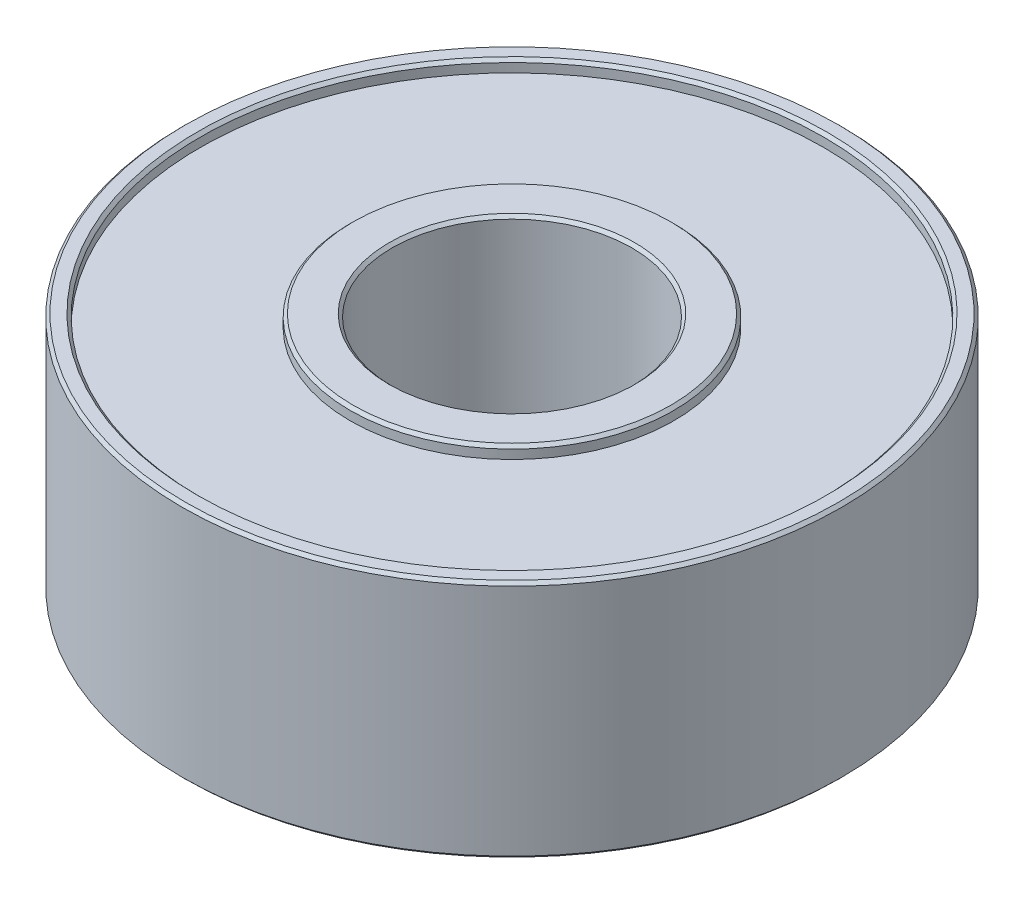
ISO-10303-21;
HEADER;
FILE_DESCRIPTION(('STEP AP214'),'2;1');
FILE_NAME('part.step','',(''),(''),'','','');
FILE_SCHEMA(('AUTOMOTIVE_DESIGN { 1 0 10303 214 1 1 1 1 }'));
ENDSEC;
DATA;
#1=APPLICATION_CONTEXT('core data for automotive mechanical design processes');
#2=APPLICATION_PROTOCOL_DEFINITION('international standard','automotive_design',2000,#1);
#3=PRODUCT_CONTEXT('',#1,'mechanical');
#4=PRODUCT('Part','Part','',(#3));
#5=PRODUCT_RELATED_PRODUCT_CATEGORY('part','',(#4));
#6=PRODUCT_DEFINITION_FORMATION('','',#4);
#7=PRODUCT_DEFINITION_CONTEXT('part definition',#1,'design');
#8=PRODUCT_DEFINITION('design','',#6,#7);
#9=PRODUCT_DEFINITION_SHAPE('','',#8);
#10=(LENGTH_UNIT() NAMED_UNIT(*) SI_UNIT(.MILLI.,.METRE.));
#11=(NAMED_UNIT(*) PLANE_ANGLE_UNIT() SI_UNIT($,.RADIAN.));
#12=(NAMED_UNIT(*) SI_UNIT($,.STERADIAN.) SOLID_ANGLE_UNIT());
#13=UNCERTAINTY_MEASURE_WITH_UNIT(LENGTH_MEASURE(1.E-05),#10,'distance_accuracy_value','');
#14=(GEOMETRIC_REPRESENTATION_CONTEXT(3) GLOBAL_UNCERTAINTY_ASSIGNED_CONTEXT((#13)) GLOBAL_UNIT_ASSIGNED_CONTEXT((#10,
#11,#12)) REPRESENTATION_CONTEXT('',''));
#15=CARTESIAN_POINT('',(0.,0.,0.));
#16=DIRECTION('',(0.,0.,1.));
#17=DIRECTION('',(1.,0.,0.));
#18=AXIS2_PLACEMENT_3D('',#15,#16,#17);
#19=CARTESIAN_POINT('',(0.,0.,0.));
#20=DIRECTION('',(0.,1.,0.));
#21=DIRECTION('',(0.,0.,1.));
#22=AXIS2_PLACEMENT_3D('',#19,#20,#21);
#23=PLANE('',#22);
#24=CARTESIAN_POINT('',(0.,0.,0.));
#25=DIRECTION('',(0.,1.,0.));
#26=DIRECTION('',(0.,0.,1.));
#27=AXIS2_PLACEMENT_3D('',#24,#25,#26);
#28=CIRCLE('',#27,2.65);
#29=CARTESIAN_POINT('',(0.,0.,2.65));
#30=VERTEX_POINT('',#29);
#31=EDGE_CURVE('E87',#30,#30,#28,.F.);
#32=ORIENTED_EDGE('',*,*,#31,.T.);
#33=EDGE_LOOP('',(#32));
#34=FACE_BOUND('',#33,.T.);
#35=CARTESIAN_POINT('',(0.,0.,0.));
#36=DIRECTION('',(0.,1.,0.));
#37=DIRECTION('',(0.,0.,1.));
#38=AXIS2_PLACEMENT_3D('',#35,#36,#37);
#39=CIRCLE('',#38,2.05);
#40=CARTESIAN_POINT('',(0.,0.,2.05));
#41=VERTEX_POINT('',#40);
#42=EDGE_CURVE('E90',#41,#41,#39,.T.);
#43=ORIENTED_EDGE('',*,*,#42,.T.);
#44=EDGE_LOOP('',(#43));
#45=FACE_BOUND('',#44,.T.);
#46=ADVANCED_FACE('F39',(#34,#45),#23,.F.);
#47=CARTESIAN_POINT('',(0.,4.,0.));
#48=DIRECTION('',(0.,1.,0.));
#49=DIRECTION('',(0.,0.,1.));
#50=AXIS2_PLACEMENT_3D('',#47,#48,#49);
#51=PLANE('',#50);
#52=CARTESIAN_POINT('',(0.,4.,0.));
#53=DIRECTION('',(0.,1.,0.));
#54=DIRECTION('',(0.,0.,1.));
#55=AXIS2_PLACEMENT_3D('',#52,#53,#54);
#56=CIRCLE('',#55,2.65);
#57=CARTESIAN_POINT('',(0.,4.,2.65));
#58=VERTEX_POINT('',#57);
#59=EDGE_CURVE('E60',#58,#58,#56,.T.);
#60=ORIENTED_EDGE('',*,*,#59,.T.);
#61=EDGE_LOOP('',(#60));
#62=FACE_BOUND('',#61,.T.);
#63=CARTESIAN_POINT('',(0.,4.,0.));
#64=DIRECTION('',(0.,1.,0.));
#65=DIRECTION('',(0.,0.,1.));
#66=AXIS2_PLACEMENT_3D('',#63,#64,#65);
#67=CIRCLE('',#66,2.05);
#68=CARTESIAN_POINT('',(0.,4.,2.05));
#69=VERTEX_POINT('',#68);
#70=EDGE_CURVE('E63',#69,#69,#67,.F.);
#71=ORIENTED_EDGE('',*,*,#70,.T.);
#72=EDGE_LOOP('',(#71));
#73=FACE_BOUND('',#72,.T.);
#74=ADVANCED_FACE('F127',(#62,#73),#51,.T.);
#75=CARTESIAN_POINT('',(0.,4.,0.));
#76=DIRECTION('',(0.,1.,0.));
#77=DIRECTION('',(0.,0.,1.));
#78=AXIS2_PLACEMENT_3D('',#75,#76,#77);
#79=CIRCLE('',#78,5.45000000000001);
#80=CARTESIAN_POINT('',(0.,4.,5.45000000000001));
#81=VERTEX_POINT('',#80);
#82=EDGE_CURVE('E47',#81,#81,#79,.T.);
#83=ORIENTED_EDGE('',*,*,#82,.T.);
#84=EDGE_LOOP('',(#83));
#85=FACE_BOUND('',#84,.T.);
#86=CARTESIAN_POINT('',(0.,4.,0.));
#87=DIRECTION('',(0.,1.,0.));
#88=DIRECTION('',(0.,0.,1.));
#89=AXIS2_PLACEMENT_3D('',#86,#87,#88);
#90=CIRCLE('',#89,5.25);
#91=CARTESIAN_POINT('',(0.,4.,5.25));
#92=VERTEX_POINT('',#91);
#93=EDGE_CURVE('E51',#92,#92,#90,.F.);
#94=ORIENTED_EDGE('',*,*,#93,.T.);
#95=EDGE_LOOP('',(#94));
#96=FACE_BOUND('',#95,.T.);
#97=ADVANCED_FACE('F134',(#85,#96),#51,.T.);
#98=CARTESIAN_POINT('',(0.,0.,0.));
#99=DIRECTION('',(0.,1.,0.));
#100=DIRECTION('',(0.,0.,1.));
#101=AXIS2_PLACEMENT_3D('',#98,#99,#100);
#102=CIRCLE('',#101,5.45);
#103=CARTESIAN_POINT('',(0.,0.,5.45));
#104=VERTEX_POINT('',#103);
#105=EDGE_CURVE('E69',#104,#104,#102,.F.);
#106=ORIENTED_EDGE('',*,*,#105,.T.);
#107=EDGE_LOOP('',(#106));
#108=FACE_BOUND('',#107,.T.);
#109=CARTESIAN_POINT('',(0.,0.,0.));
#110=DIRECTION('',(0.,1.,0.));
#111=DIRECTION('',(0.,0.,1.));
#112=AXIS2_PLACEMENT_3D('',#109,#110,#111);
#113=CIRCLE('',#112,5.25);
#114=CARTESIAN_POINT('',(0.,0.,5.25));
#115=VERTEX_POINT('',#114);
#116=EDGE_CURVE('E72',#115,#115,#113,.T.);
#117=ORIENTED_EDGE('',*,*,#116,.T.);
#118=EDGE_LOOP('',(#117));
#119=FACE_BOUND('',#118,.T.);
#120=ADVANCED_FACE('F130',(#108,#119),#23,.F.);
#121=CARTESIAN_POINT('',(0.,4.,0.));
#122=DIRECTION('',(0.,-1.,0.));
#123=DIRECTION('',(0.,0.,-1.));
#124=AXIS2_PLACEMENT_3D('',#121,#122,#123);
#125=CYLINDRICAL_SURFACE('',#124,5.5);
#126=CARTESIAN_POINT('',(0.,0.0499999999999997,0.));
#127=DIRECTION('',(0.,1.,0.));
#128=DIRECTION('',(0.,0.,1.));
#129=AXIS2_PLACEMENT_3D('',#126,#127,#128);
#130=CIRCLE('',#129,5.5);
#131=CARTESIAN_POINT('',(0.,0.0499999999999997,5.5));
#132=VERTEX_POINT('',#131);
#133=EDGE_CURVE('E75',#132,#132,#130,.T.);
#134=ORIENTED_EDGE('',*,*,#133,.T.);
#135=EDGE_LOOP('',(#134));
#136=FACE_BOUND('',#135,.T.);
#137=CARTESIAN_POINT('',(0.,3.95,0.));
#138=DIRECTION('',(0.,1.,0.));
#139=DIRECTION('',(0.,0.,1.));
#140=AXIS2_PLACEMENT_3D('',#137,#138,#139);
#141=CIRCLE('',#140,5.5);
#142=CARTESIAN_POINT('',(0.,3.95,5.5));
#143=VERTEX_POINT('',#142);
#144=EDGE_CURVE('E78',#143,#143,#141,.F.);
#145=ORIENTED_EDGE('',*,*,#144,.T.);
#146=EDGE_LOOP('',(#145));
#147=FACE_BOUND('',#146,.T.);
#148=ADVANCED_FACE('F140',(#136,#147),#125,.T.);
#149=CARTESIAN_POINT('',(0.,4.,0.));
#150=DIRECTION('',(0.,-1.,0.));
#151=DIRECTION('',(0.,0.,-1.));
#152=AXIS2_PLACEMENT_3D('',#149,#150,#151);
#153=CYLINDRICAL_SURFACE('',#152,2.);
#154=CARTESIAN_POINT('',(0.,0.049999999999998,0.));
#155=DIRECTION('',(0.,1.,0.));
#156=DIRECTION('',(0.,0.,1.));
#157=AXIS2_PLACEMENT_3D('',#154,#155,#156);
#158=CIRCLE('',#157,2.);
#159=CARTESIAN_POINT('',(0.,0.049999999999998,2.));
#160=VERTEX_POINT('',#159);
#161=EDGE_CURVE('E81',#160,#160,#158,.F.);
#162=ORIENTED_EDGE('',*,*,#161,.T.);
#163=EDGE_LOOP('',(#162));
#164=FACE_BOUND('',#163,.T.);
#165=CARTESIAN_POINT('',(0.,3.95,0.));
#166=DIRECTION('',(0.,1.,0.));
#167=DIRECTION('',(0.,0.,1.));
#168=AXIS2_PLACEMENT_3D('',#165,#166,#167);
#169=CIRCLE('',#168,2.);
#170=CARTESIAN_POINT('',(0.,3.95,2.));
#171=VERTEX_POINT('',#170);
#172=EDGE_CURVE('E84',#171,#171,#169,.T.);
#173=ORIENTED_EDGE('',*,*,#172,.T.);
#174=EDGE_LOOP('',(#173));
#175=FACE_BOUND('',#174,.T.);
#176=ADVANCED_FACE('F146',(#164,#175),#153,.F.);
#177=CARTESIAN_POINT('',(0.,3.8,0.));
#178=DIRECTION('',(0.,1.,0.));
#179=DIRECTION('',(0.,0.,1.));
#180=AXIS2_PLACEMENT_3D('',#177,#178,#179);
#181=CYLINDRICAL_SURFACE('',#180,5.2);
#182=CARTESIAN_POINT('',(0.,3.95,0.));
#183=DIRECTION('',(0.,1.,0.));
#184=DIRECTION('',(0.,0.,1.));
#185=AXIS2_PLACEMENT_3D('',#182,#183,#184);
#186=CIRCLE('',#185,5.2);
#187=CARTESIAN_POINT('',(0.,3.95,5.2));
#188=VERTEX_POINT('',#187);
#189=EDGE_CURVE('E10',#188,#188,#186,.T.);
#190=ORIENTED_EDGE('',*,*,#189,.T.);
#191=EDGE_LOOP('',(#190));
#192=FACE_BOUND('',#191,.T.);
#193=CARTESIAN_POINT('',(0.,3.8,0.));
#194=DIRECTION('',(0.,1.,0.));
#195=DIRECTION('',(0.,0.,1.));
#196=AXIS2_PLACEMENT_3D('',#193,#194,#195);
#197=CIRCLE('',#196,5.2);
#198=CARTESIAN_POINT('',(0.,3.8,5.2));
#199=VERTEX_POINT('',#198);
#200=EDGE_CURVE('E96',#199,#199,#197,.T.);
#201=ORIENTED_EDGE('',*,*,#200,.F.);
#202=EDGE_LOOP('',(#201));
#203=FACE_BOUND('',#202,.T.);
#204=ADVANCED_FACE('F273',(#192,#203),#181,.F.);
#205=CARTESIAN_POINT('',(0.,3.8,0.));
#206=DIRECTION('',(0.,1.,0.));
#207=DIRECTION('',(0.,0.,1.));
#208=AXIS2_PLACEMENT_3D('',#205,#206,#207);
#209=PLANE('',#208);
#210=CARTESIAN_POINT('',(0.,3.8,0.));
#211=DIRECTION('',(0.,1.,0.));
#212=DIRECTION('',(0.,0.,1.));
#213=AXIS2_PLACEMENT_3D('',#210,#211,#212);
#214=CIRCLE('',#213,2.7);
#215=CARTESIAN_POINT('',(0.,3.8,2.7));
#216=VERTEX_POINT('',#215);
#217=EDGE_CURVE('E99',#216,#216,#214,.T.);
#218=ORIENTED_EDGE('',*,*,#217,.F.);
#219=EDGE_LOOP('',(#218));
#220=FACE_BOUND('',#219,.T.);
#221=ORIENTED_EDGE('',*,*,#200,.T.);
#222=EDGE_LOOP('',(#221));
#223=FACE_BOUND('',#222,.T.);
#224=ADVANCED_FACE('F265',(#220,#223),#209,.T.);
#225=CARTESIAN_POINT('',(0.,3.8,0.));
#226=DIRECTION('',(0.,1.,0.));
#227=DIRECTION('',(0.,0.,1.));
#228=AXIS2_PLACEMENT_3D('',#225,#226,#227);
#229=CYLINDRICAL_SURFACE('',#228,2.7);
#230=CARTESIAN_POINT('',(0.,3.95,0.));
#231=DIRECTION('',(0.,1.,0.));
#232=DIRECTION('',(0.,0.,1.));
#233=AXIS2_PLACEMENT_3D('',#230,#231,#232);
#234=CIRCLE('',#233,2.7);
#235=CARTESIAN_POINT('',(0.,3.95,2.7));
#236=VERTEX_POINT('',#235);
#237=EDGE_CURVE('E55',#236,#236,#234,.F.);
#238=ORIENTED_EDGE('',*,*,#237,.T.);
#239=EDGE_LOOP('',(#238));
#240=FACE_BOUND('',#239,.T.);
#241=ORIENTED_EDGE('',*,*,#217,.T.);
#242=EDGE_LOOP('',(#241));
#243=FACE_BOUND('',#242,.T.);
#244=ADVANCED_FACE('F254',(#240,#243),#229,.T.);
#245=CARTESIAN_POINT('',(0.,0.,0.));
#246=DIRECTION('',(0.,1.,0.));
#247=DIRECTION('',(0.,0.,1.));
#248=AXIS2_PLACEMENT_3D('',#245,#246,#247);
#249=CYLINDRICAL_SURFACE('',#248,5.2);
#250=CARTESIAN_POINT('',(0.,0.0499999999999988,0.));
#251=DIRECTION('',(0.,1.,0.));
#252=DIRECTION('',(0.,0.,1.));
#253=AXIS2_PLACEMENT_3D('',#250,#251,#252);
#254=CIRCLE('',#253,5.2);
#255=CARTESIAN_POINT('',(0.,0.0499999999999988,5.2));
#256=VERTEX_POINT('',#255);
#257=EDGE_CURVE('E66',#256,#256,#254,.F.);
#258=ORIENTED_EDGE('',*,*,#257,.T.);
#259=EDGE_LOOP('',(#258));
#260=FACE_BOUND('',#259,.T.);
#261=CARTESIAN_POINT('',(0.,0.2,0.));
#262=DIRECTION('',(0.,1.,0.));
#263=DIRECTION('',(0.,0.,1.));
#264=AXIS2_PLACEMENT_3D('',#261,#262,#263);
#265=CIRCLE('',#264,5.2);
#266=CARTESIAN_POINT('',(0.,0.2,5.2));
#267=VERTEX_POINT('',#266);
#268=EDGE_CURVE('E102',#267,#267,#265,.T.);
#269=ORIENTED_EDGE('',*,*,#268,.T.);
#270=EDGE_LOOP('',(#269));
#271=FACE_BOUND('',#270,.T.);
#272=ADVANCED_FACE('F124',(#260,#271),#249,.F.);
#273=CARTESIAN_POINT('',(0.,0.2,0.));
#274=DIRECTION('',(0.,1.,0.));
#275=DIRECTION('',(0.,0.,1.));
#276=AXIS2_PLACEMENT_3D('',#273,#274,#275);
#277=PLANE('',#276);
#278=CARTESIAN_POINT('',(0.,0.2,0.));
#279=DIRECTION('',(0.,1.,0.));
#280=DIRECTION('',(0.,0.,1.));
#281=AXIS2_PLACEMENT_3D('',#278,#279,#280);
#282=CIRCLE('',#281,2.7);
#283=CARTESIAN_POINT('',(0.,0.2,2.7));
#284=VERTEX_POINT('',#283);
#285=EDGE_CURVE('E105',#284,#284,#282,.T.);
#286=ORIENTED_EDGE('',*,*,#285,.T.);
#287=EDGE_LOOP('',(#286));
#288=FACE_BOUND('',#287,.T.);
#289=ORIENTED_EDGE('',*,*,#268,.F.);
#290=EDGE_LOOP('',(#289));
#291=FACE_BOUND('',#290,.T.);
#292=ADVANCED_FACE('F109',(#288,#291),#277,.F.);
#293=CARTESIAN_POINT('',(0.,0.,0.));
#294=DIRECTION('',(0.,1.,0.));
#295=DIRECTION('',(0.,0.,1.));
#296=AXIS2_PLACEMENT_3D('',#293,#294,#295);
#297=CYLINDRICAL_SURFACE('',#296,2.7);
#298=CARTESIAN_POINT('',(0.,0.0500000000000014,0.));
#299=DIRECTION('',(0.,1.,0.));
#300=DIRECTION('',(0.,0.,1.));
#301=AXIS2_PLACEMENT_3D('',#298,#299,#300);
#302=CIRCLE('',#301,2.7);
#303=CARTESIAN_POINT('',(0.,0.0500000000000014,2.7));
#304=VERTEX_POINT('',#303);
#305=EDGE_CURVE('E93',#304,#304,#302,.T.);
#306=ORIENTED_EDGE('',*,*,#305,.T.);
#307=EDGE_LOOP('',(#306));
#308=FACE_BOUND('',#307,.T.);
#309=ORIENTED_EDGE('',*,*,#285,.F.);
#310=EDGE_LOOP('',(#309));
#311=FACE_BOUND('',#310,.T.);
#312=ADVANCED_FACE('F112',(#308,#311),#297,.T.);
#313=CARTESIAN_POINT('',(0.,0.0500000000000014,0.));
#314=DIRECTION('',(0.,1.,0.));
#315=DIRECTION('',(0.,0.,1.));
#316=AXIS2_PLACEMENT_3D('',#313,#314,#315);
#317=CONICAL_SURFACE('',#316,2.7,0.78539816339744);
#318=ORIENTED_EDGE('',*,*,#31,.F.);
#319=EDGE_LOOP('',(#318));
#320=FACE_BOUND('',#319,.T.);
#321=ORIENTED_EDGE('',*,*,#305,.F.);
#322=EDGE_LOOP('',(#321));
#323=FACE_BOUND('',#322,.T.);
#324=ADVANCED_FACE('F114',(#320,#323),#317,.T.);
#325=CARTESIAN_POINT('',(0.,0.,0.));
#326=DIRECTION('',(0.,-1.,0.));
#327=DIRECTION('',(0.,0.,-1.));
#328=AXIS2_PLACEMENT_3D('',#325,#326,#327);
#329=CONICAL_SURFACE('',#328,2.05,0.785398163397431);
#330=ORIENTED_EDGE('',*,*,#161,.F.);
#331=EDGE_LOOP('',(#330));
#332=FACE_BOUND('',#331,.T.);
#333=ORIENTED_EDGE('',*,*,#42,.F.);
#334=EDGE_LOOP('',(#333));
#335=FACE_BOUND('',#334,.T.);
#336=ADVANCED_FACE('F121',(#332,#335),#329,.F.);
#337=CARTESIAN_POINT('',(0.,0.0499999999999997,0.));
#338=DIRECTION('',(0.,1.,0.));
#339=DIRECTION('',(0.,0.,1.));
#340=AXIS2_PLACEMENT_3D('',#337,#338,#339);
#341=CONICAL_SURFACE('',#340,5.5,0.785398163397448);
#342=ORIENTED_EDGE('',*,*,#105,.F.);
#343=EDGE_LOOP('',(#342));
#344=FACE_BOUND('',#343,.T.);
#345=ORIENTED_EDGE('',*,*,#133,.F.);
#346=EDGE_LOOP('',(#345));
#347=FACE_BOUND('',#346,.T.);
#348=ADVANCED_FACE('F155',(#344,#347),#341,.T.);
#349=CARTESIAN_POINT('',(0.,0.,0.));
#350=DIRECTION('',(0.,-1.,0.));
#351=DIRECTION('',(0.,0.,-1.));
#352=AXIS2_PLACEMENT_3D('',#349,#350,#351);
#353=CONICAL_SURFACE('',#352,5.25,0.78539816339744);
#354=ORIENTED_EDGE('',*,*,#257,.F.);
#355=EDGE_LOOP('',(#354));
#356=FACE_BOUND('',#355,.T.);
#357=ORIENTED_EDGE('',*,*,#116,.F.);
#358=EDGE_LOOP('',(#357));
#359=FACE_BOUND('',#358,.T.);
#360=ADVANCED_FACE('F152',(#356,#359),#353,.F.);
#361=CARTESIAN_POINT('',(0.,4.,0.));
#362=DIRECTION('',(0.,-1.,0.));
#363=DIRECTION('',(0.,0.,-1.));
#364=AXIS2_PLACEMENT_3D('',#361,#362,#363);
#365=CONICAL_SURFACE('',#364,2.65,0.78539816339744);
#366=ORIENTED_EDGE('',*,*,#237,.F.);
#367=EDGE_LOOP('',(#366));
#368=FACE_BOUND('',#367,.T.);
#369=ORIENTED_EDGE('',*,*,#59,.F.);
#370=EDGE_LOOP('',(#369));
#371=FACE_BOUND('',#370,.T.);
#372=ADVANCED_FACE('F154',(#368,#371),#365,.T.);
#373=CARTESIAN_POINT('',(0.,3.95,0.));
#374=DIRECTION('',(0.,1.,0.));
#375=DIRECTION('',(0.,0.,1.));
#376=AXIS2_PLACEMENT_3D('',#373,#374,#375);
#377=CONICAL_SURFACE('',#376,2.,0.785398163397448);
#378=ORIENTED_EDGE('',*,*,#70,.F.);
#379=EDGE_LOOP('',(#378));
#380=FACE_BOUND('',#379,.T.);
#381=ORIENTED_EDGE('',*,*,#172,.F.);
#382=EDGE_LOOP('',(#381));
#383=FACE_BOUND('',#382,.T.);
#384=ADVANCED_FACE('F162',(#380,#383),#377,.F.);
#385=CARTESIAN_POINT('',(0.,4.,0.));
#386=DIRECTION('',(0.,-1.,0.));
#387=DIRECTION('',(0.,0.,-1.));
#388=AXIS2_PLACEMENT_3D('',#385,#386,#387);
#389=CONICAL_SURFACE('',#388,5.45000000000001,0.785398163397431);
#390=ORIENTED_EDGE('',*,*,#144,.F.);
#391=EDGE_LOOP('',(#390));
#392=FACE_BOUND('',#391,.T.);
#393=ORIENTED_EDGE('',*,*,#82,.F.);
#394=EDGE_LOOP('',(#393));
#395=FACE_BOUND('',#394,.T.);
#396=ADVANCED_FACE('F182',(#392,#395),#389,.T.);
#397=CARTESIAN_POINT('',(0.,3.95,0.));
#398=DIRECTION('',(0.,1.,0.));
#399=DIRECTION('',(0.,0.,1.));
#400=AXIS2_PLACEMENT_3D('',#397,#398,#399);
#401=CONICAL_SURFACE('',#400,5.2,0.78539816339744);
#402=ORIENTED_EDGE('',*,*,#93,.F.);
#403=EDGE_LOOP('',(#402));
#404=FACE_BOUND('',#403,.T.);
#405=ORIENTED_EDGE('',*,*,#189,.F.);
#406=EDGE_LOOP('',(#405));
#407=FACE_BOUND('',#406,.T.);
#408=ADVANCED_FACE('F42',(#404,#407),#401,.F.);
#409=CLOSED_SHELL('',(#46,#74,#97,#120,#148,#176,#204,#224,#244,#272,#292,#312,#324,#336,#348,
#360,#372,#384,#396,#408));
#410=MANIFOLD_SOLID_BREP('B2',#409);
#411=ADVANCED_BREP_SHAPE_REPRESENTATION('',(#18,#410),#14);
#412=SHAPE_DEFINITION_REPRESENTATION(#9,#411);
ENDSEC;
END-ISO-10303-21;
